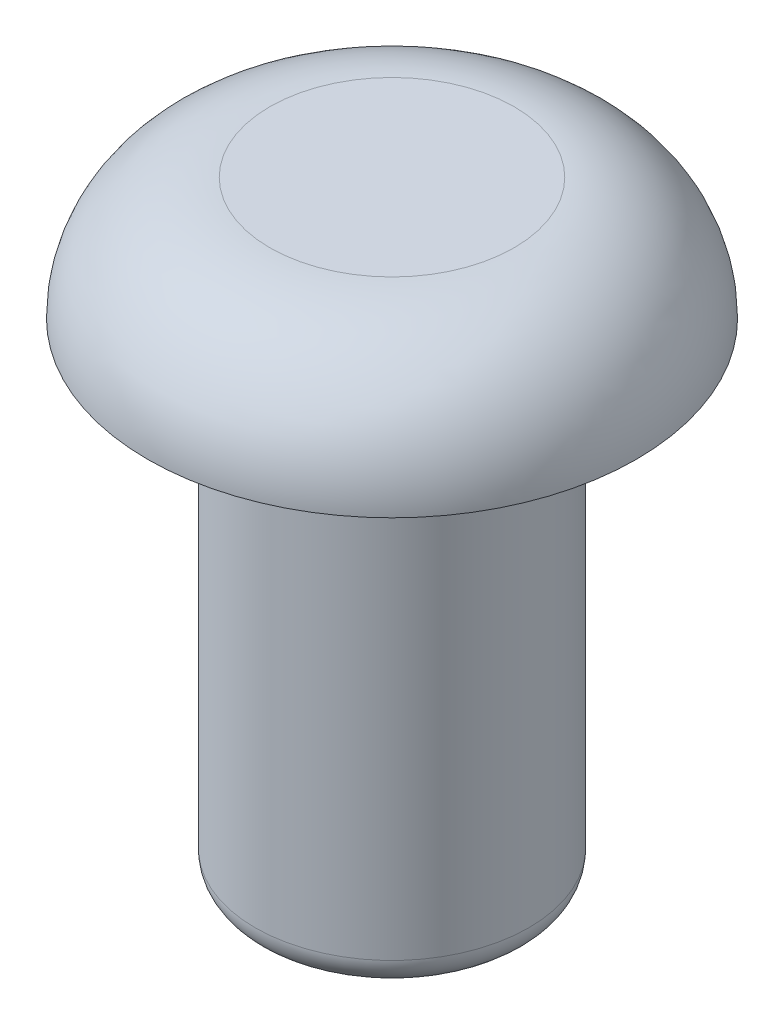
ISO-10303-21;
HEADER;
FILE_DESCRIPTION(('STEP AP214'),'2;1');
FILE_NAME('part.step','',(''),(''),'','','');
FILE_SCHEMA(('AUTOMOTIVE_DESIGN { 1 0 10303 214 1 1 1 1 }'));
ENDSEC;
DATA;
#1=APPLICATION_CONTEXT('core data for automotive mechanical design processes');
#2=APPLICATION_PROTOCOL_DEFINITION('international standard','automotive_design',2000,#1);
#3=PRODUCT_CONTEXT('',#1,'mechanical');
#4=PRODUCT('Part','Part','',(#3));
#5=PRODUCT_RELATED_PRODUCT_CATEGORY('part','',(#4));
#6=PRODUCT_DEFINITION_FORMATION('','',#4);
#7=PRODUCT_DEFINITION_CONTEXT('part definition',#1,'design');
#8=PRODUCT_DEFINITION('design','',#6,#7);
#9=PRODUCT_DEFINITION_SHAPE('','',#8);
#10=(LENGTH_UNIT() NAMED_UNIT(*) SI_UNIT(.MILLI.,.METRE.));
#11=(NAMED_UNIT(*) PLANE_ANGLE_UNIT() SI_UNIT($,.RADIAN.));
#12=(NAMED_UNIT(*) SI_UNIT($,.STERADIAN.) SOLID_ANGLE_UNIT());
#13=UNCERTAINTY_MEASURE_WITH_UNIT(LENGTH_MEASURE(1.E-05),#10,'distance_accuracy_value','');
#14=(GEOMETRIC_REPRESENTATION_CONTEXT(3) GLOBAL_UNCERTAINTY_ASSIGNED_CONTEXT((#13)) GLOBAL_UNIT_ASSIGNED_CONTEXT((#10,
#11,#12)) REPRESENTATION_CONTEXT('',''));
#15=CARTESIAN_POINT('',(0.,0.,0.));
#16=DIRECTION('',(0.,0.,1.));
#17=DIRECTION('',(1.,0.,0.));
#18=AXIS2_PLACEMENT_3D('',#15,#16,#17);
#19=CARTESIAN_POINT('',(0.,7.9375,0.));
#20=DIRECTION('',(0.,1.,0.));
#21=DIRECTION('',(0.,0.,1.));
#22=AXIS2_PLACEMENT_3D('',#19,#20,#21);
#23=PLANE('',#22);
#24=CARTESIAN_POINT('',(0.,7.9375,0.));
#25=DIRECTION('',(0.,-1.,0.));
#26=DIRECTION('',(0.,0.,-1.));
#27=AXIS2_PLACEMENT_3D('',#24,#25,#26);
#28=CIRCLE('',#27,1.5875);
#29=CARTESIAN_POINT('',(0.,7.9375,-1.5875));
#30=VERTEX_POINT('',#29);
#31=EDGE_CURVE('E42',#30,#30,#28,.T.);
#32=ORIENTED_EDGE('',*,*,#31,.F.);
#33=EDGE_LOOP('',(#32));
#34=FACE_BOUND('',#33,.T.);
#35=ADVANCED_FACE('F31',(#34),#23,.T.);
#36=CARTESIAN_POINT('',(0.,6.35,0.));
#37=DIRECTION('',(0.,-1.,0.));
#38=DIRECTION('',(0.,0.,-1.));
#39=AXIS2_PLACEMENT_3D('',#36,#37,#38);
#40=DEGENERATE_TOROIDAL_SURFACE('',#39,1.5875,1.5875,.T.);
#41=ORIENTED_EDGE('',*,*,#31,.T.);
#42=EDGE_LOOP('',(#41));
#43=FACE_BOUND('',#42,.T.);
#44=CARTESIAN_POINT('',(0.,6.35,0.));
#45=DIRECTION('',(0.,-1.,0.));
#46=DIRECTION('',(0.,0.,-1.));
#47=AXIS2_PLACEMENT_3D('',#44,#45,#46);
#48=CIRCLE('',#47,3.175);
#49=CARTESIAN_POINT('',(0.,6.35,-3.175));
#50=VERTEX_POINT('',#49);
#51=EDGE_CURVE('E46',#50,#50,#48,.T.);
#52=ORIENTED_EDGE('',*,*,#51,.F.);
#53=EDGE_LOOP('',(#52));
#54=FACE_BOUND('',#53,.T.);
#55=ADVANCED_FACE('F59',(#43,#54),#40,.T.);
#56=CARTESIAN_POINT('',(0.,6.35,-1.778));
#57=DIRECTION('',(0.,-1.,0.));
#58=DIRECTION('',(0.,0.,-1.));
#59=AXIS2_PLACEMENT_3D('',#56,#57,#58);
#60=PLANE('',#59);
#61=ORIENTED_EDGE('',*,*,#51,.T.);
#62=EDGE_LOOP('',(#61));
#63=FACE_BOUND('',#62,.T.);
#64=CARTESIAN_POINT('',(0.,6.35,0.));
#65=DIRECTION('',(0.,-1.,0.));
#66=DIRECTION('',(0.,0.,-1.));
#67=AXIS2_PLACEMENT_3D('',#64,#65,#66);
#68=CIRCLE('',#67,1.778);
#69=CARTESIAN_POINT('',(0.,6.35,-1.778));
#70=VERTEX_POINT('',#69);
#71=EDGE_CURVE('E51',#70,#70,#68,.T.);
#72=ORIENTED_EDGE('',*,*,#71,.F.);
#73=EDGE_LOOP('',(#72));
#74=FACE_BOUND('',#73,.T.);
#75=ADVANCED_FACE('F57',(#63,#74),#60,.T.);
#76=CARTESIAN_POINT('',(0.,0.,0.));
#77=DIRECTION('',(0.,-1.,0.));
#78=DIRECTION('',(0.,0.,-1.));
#79=AXIS2_PLACEMENT_3D('',#76,#77,#78);
#80=CYLINDRICAL_SURFACE('',#79,1.778);
#81=CARTESIAN_POINT('',(0.,0.381,0.));
#82=DIRECTION('',(0.,-1.,0.));
#83=DIRECTION('',(0.,0.,-1.));
#84=AXIS2_PLACEMENT_3D('',#81,#82,#83);
#85=CIRCLE('',#84,1.778);
#86=CARTESIAN_POINT('',(0.,0.381,-1.778));
#87=VERTEX_POINT('',#86);
#88=EDGE_CURVE('E10',#87,#87,#85,.F.);
#89=ORIENTED_EDGE('',*,*,#88,.T.);
#90=EDGE_LOOP('',(#89));
#91=FACE_BOUND('',#90,.T.);
#92=ORIENTED_EDGE('',*,*,#71,.T.);
#93=EDGE_LOOP('',(#92));
#94=FACE_BOUND('',#93,.T.);
#95=ADVANCED_FACE('F55',(#91,#94),#80,.T.);
#96=CARTESIAN_POINT('',(0.,0.,0.));
#97=DIRECTION('',(0.,-1.,0.));
#98=DIRECTION('',(0.,0.,-1.));
#99=AXIS2_PLACEMENT_3D('',#96,#97,#98);
#100=PLANE('',#99);
#101=CARTESIAN_POINT('',(0.,0.,0.));
#102=DIRECTION('',(0.,-1.,0.));
#103=DIRECTION('',(0.,0.,-1.));
#104=AXIS2_PLACEMENT_3D('',#101,#102,#103);
#105=CIRCLE('',#104,1.397);
#106=CARTESIAN_POINT('',(0.,0.,-1.397));
#107=VERTEX_POINT('',#106);
#108=EDGE_CURVE('E38',#107,#107,#105,.T.);
#109=ORIENTED_EDGE('',*,*,#108,.T.);
#110=EDGE_LOOP('',(#109));
#111=FACE_BOUND('',#110,.T.);
#112=ADVANCED_FACE('F66',(#111),#100,.T.);
#113=CARTESIAN_POINT('',(0.,0.381,0.));
#114=DIRECTION('',(0.,-1.,0.));
#115=DIRECTION('',(0.,0.,-1.));
#116=AXIS2_PLACEMENT_3D('',#113,#114,#115);
#117=TOROIDAL_SURFACE('',#116,1.397,0.381);
#118=ORIENTED_EDGE('',*,*,#88,.F.);
#119=EDGE_LOOP('',(#118));
#120=FACE_BOUND('',#119,.T.);
#121=ORIENTED_EDGE('',*,*,#108,.F.);
#122=EDGE_LOOP('',(#121));
#123=FACE_BOUND('',#122,.T.);
#124=ADVANCED_FACE('F33',(#120,#123),#117,.T.);
#125=CLOSED_SHELL('',(#35,#55,#75,#95,#112,#124));
#126=MANIFOLD_SOLID_BREP('B2',#125);
#127=ADVANCED_BREP_SHAPE_REPRESENTATION('',(#18,#126),#14);
#128=SHAPE_DEFINITION_REPRESENTATION(#9,#127);
ENDSEC;
END-ISO-10303-21;
